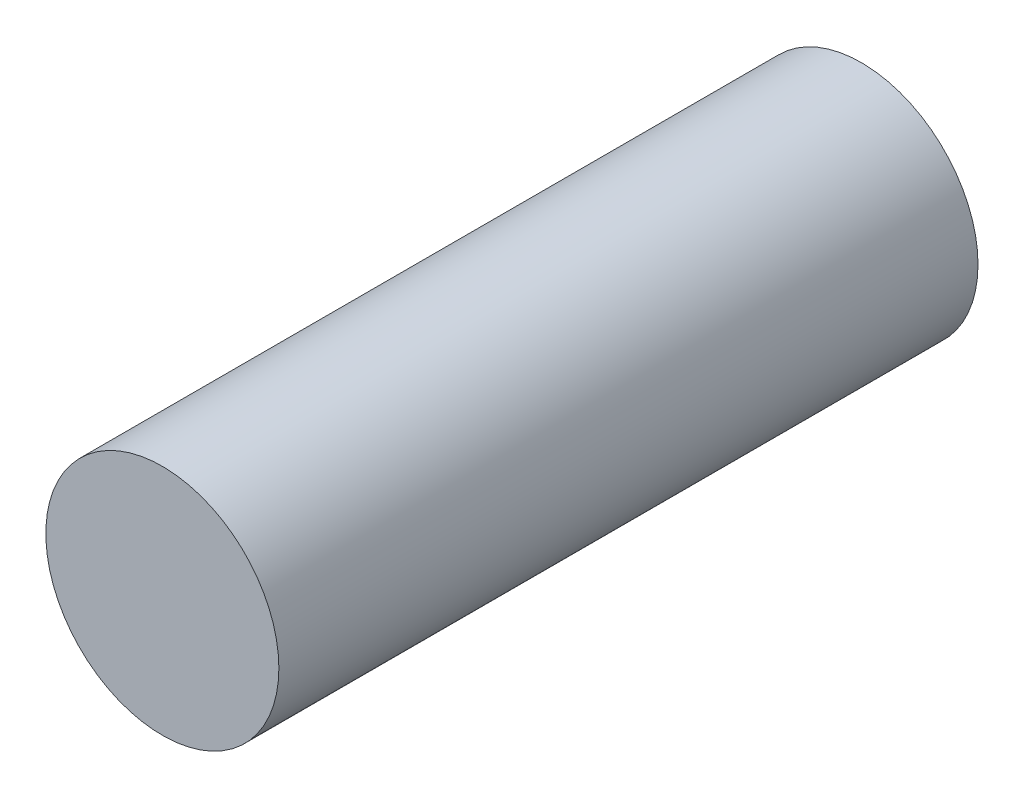
ISO-10303-21;
HEADER;
FILE_DESCRIPTION(('STEP AP214'),'2;1');
FILE_NAME('part.step','',(''),(''),'','','');
FILE_SCHEMA(('AUTOMOTIVE_DESIGN { 1 0 10303 214 1 1 1 1 }'));
ENDSEC;
DATA;
#1=APPLICATION_CONTEXT('core data for automotive mechanical design processes');
#2=APPLICATION_PROTOCOL_DEFINITION('international standard','automotive_design',2000,#1);
#3=PRODUCT_CONTEXT('',#1,'mechanical');
#4=PRODUCT('Part','Part','',(#3));
#5=PRODUCT_RELATED_PRODUCT_CATEGORY('part','',(#4));
#6=PRODUCT_DEFINITION_FORMATION('','',#4);
#7=PRODUCT_DEFINITION_CONTEXT('part definition',#1,'design');
#8=PRODUCT_DEFINITION('design','',#6,#7);
#9=PRODUCT_DEFINITION_SHAPE('','',#8);
#10=(LENGTH_UNIT() NAMED_UNIT(*) SI_UNIT(.MILLI.,.METRE.));
#11=(NAMED_UNIT(*) PLANE_ANGLE_UNIT() SI_UNIT($,.RADIAN.));
#12=(NAMED_UNIT(*) SI_UNIT($,.STERADIAN.) SOLID_ANGLE_UNIT());
#13=UNCERTAINTY_MEASURE_WITH_UNIT(LENGTH_MEASURE(1.E-05),#10,'distance_accuracy_value','');
#14=(GEOMETRIC_REPRESENTATION_CONTEXT(3) GLOBAL_UNCERTAINTY_ASSIGNED_CONTEXT((#13)) GLOBAL_UNIT_ASSIGNED_CONTEXT((#10,
#11,#12)) REPRESENTATION_CONTEXT('',''));
#15=CARTESIAN_POINT('',(0.,0.,0.));
#16=DIRECTION('',(0.,0.,1.));
#17=DIRECTION('',(1.,0.,0.));
#18=AXIS2_PLACEMENT_3D('',#15,#16,#17);
#19=CARTESIAN_POINT('',(0.,0.,15.));
#20=DIRECTION('',(0.,0.,-1.));
#21=DIRECTION('',(-1.,0.,0.));
#22=AXIS2_PLACEMENT_3D('',#19,#20,#21);
#23=CYLINDRICAL_SURFACE('',#22,5.);
#24=CARTESIAN_POINT('',(0.,0.,15.));
#25=DIRECTION('',(0.,0.,1.));
#26=DIRECTION('',(1.,0.,0.));
#27=AXIS2_PLACEMENT_3D('',#24,#25,#26);
#28=CIRCLE('',#27,5.);
#29=CARTESIAN_POINT('',(5.,0.,15.));
#30=VERTEX_POINT('',#29);
#31=EDGE_CURVE('E12',#30,#30,#28,.T.);
#32=ORIENTED_EDGE('',*,*,#31,.F.);
#33=EDGE_LOOP('',(#32));
#34=FACE_BOUND('',#33,.T.);
#35=CARTESIAN_POINT('',(0.,0.,-15.));
#36=DIRECTION('',(0.,0.,1.));
#37=DIRECTION('',(1.,0.,0.));
#38=AXIS2_PLACEMENT_3D('',#35,#36,#37);
#39=CIRCLE('',#38,5.);
#40=CARTESIAN_POINT('',(5.,0.,-15.));
#41=VERTEX_POINT('',#40);
#42=EDGE_CURVE('E47',#41,#41,#39,.T.);
#43=ORIENTED_EDGE('',*,*,#42,.T.);
#44=EDGE_LOOP('',(#43));
#45=FACE_BOUND('',#44,.T.);
#46=ADVANCED_FACE('F44',(#34,#45),#23,.T.);
#47=CARTESIAN_POINT('',(0.,0.,15.));
#48=DIRECTION('',(0.,0.,1.));
#49=DIRECTION('',(1.,0.,0.));
#50=AXIS2_PLACEMENT_3D('',#47,#48,#49);
#51=PLANE('',#50);
#52=ORIENTED_EDGE('',*,*,#31,.T.);
#53=EDGE_LOOP('',(#52));
#54=FACE_BOUND('',#53,.T.);
#55=ADVANCED_FACE('F59',(#54),#51,.T.);
#56=CARTESIAN_POINT('',(0.,0.,-15.));
#57=DIRECTION('',(0.,0.,1.));
#58=DIRECTION('',(1.,0.,0.));
#59=AXIS2_PLACEMENT_3D('',#56,#57,#58);
#60=PLANE('',#59);
#61=ORIENTED_EDGE('',*,*,#42,.F.);
#62=EDGE_LOOP('',(#61));
#63=FACE_BOUND('',#62,.T.);
#64=ADVANCED_FACE('F57',(#63),#60,.F.);
#65=CLOSED_SHELL('',(#46,#55,#64));
#66=MANIFOLD_SOLID_BREP('B2',#65);
#67=ADVANCED_BREP_SHAPE_REPRESENTATION('',(#18,#66),#14);
#68=SHAPE_DEFINITION_REPRESENTATION(#9,#67);
ENDSEC;
END-ISO-10303-21;
